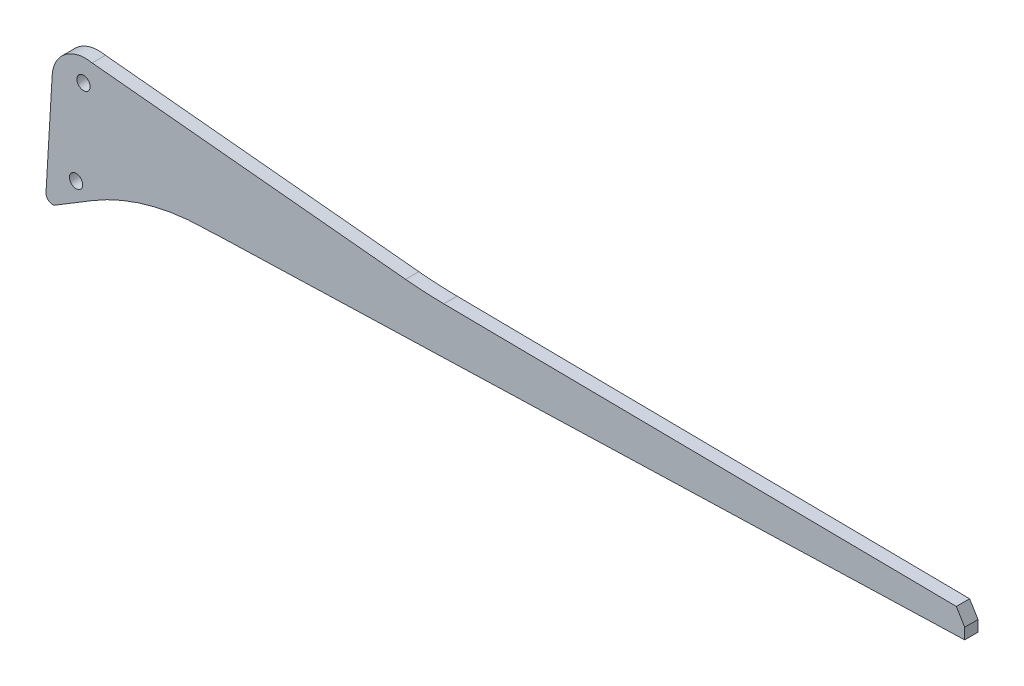
ISO-10303-21;
HEADER;
FILE_DESCRIPTION(('STEP AP214'),'2;1');
FILE_NAME('part.step','',(''),(''),'','','');
FILE_SCHEMA(('AUTOMOTIVE_DESIGN { 1 0 10303 214 1 1 1 1 }'));
ENDSEC;
DATA;
#1=APPLICATION_CONTEXT('core data for automotive mechanical design processes');
#2=APPLICATION_PROTOCOL_DEFINITION('international standard','automotive_design',2000,#1);
#3=PRODUCT_CONTEXT('',#1,'mechanical');
#4=PRODUCT('Part','Part','',(#3));
#5=PRODUCT_RELATED_PRODUCT_CATEGORY('part','',(#4));
#6=PRODUCT_DEFINITION_FORMATION('','',#4);
#7=PRODUCT_DEFINITION_CONTEXT('part definition',#1,'design');
#8=PRODUCT_DEFINITION('design','',#6,#7);
#9=PRODUCT_DEFINITION_SHAPE('','',#8);
#10=(LENGTH_UNIT() NAMED_UNIT(*) SI_UNIT(.MILLI.,.METRE.));
#11=(NAMED_UNIT(*) PLANE_ANGLE_UNIT() SI_UNIT($,.RADIAN.));
#12=(NAMED_UNIT(*) SI_UNIT($,.STERADIAN.) SOLID_ANGLE_UNIT());
#13=UNCERTAINTY_MEASURE_WITH_UNIT(LENGTH_MEASURE(1.E-05),#10,'distance_accuracy_value','');
#14=(GEOMETRIC_REPRESENTATION_CONTEXT(3) GLOBAL_UNCERTAINTY_ASSIGNED_CONTEXT((#13)) GLOBAL_UNIT_ASSIGNED_CONTEXT((#10,
#11,#12)) REPRESENTATION_CONTEXT('',''));
#15=CARTESIAN_POINT('',(0.,0.,0.));
#16=DIRECTION('',(0.,0.,1.));
#17=DIRECTION('',(1.,0.,0.));
#18=AXIS2_PLACEMENT_3D('',#15,#16,#17);
#19=CARTESIAN_POINT('',(194.893507613305,57.6898471594628,-4.5));
#20=DIRECTION('',(-0.0113371299272643,-0.999935732677362,0.));
#21=DIRECTION('',(0.999935732677362,-0.0113371299272643,0.));
#22=AXIS2_PLACEMENT_3D('',#19,#20,#21);
#23=PLANE('',#22);
#24=DIRECTION('',(0.999935732677362,-0.0113371299272643,0.));
#25=VECTOR('',#24,1.);
#26=CARTESIAN_POINT('',(194.893507613305,57.6898471594628,-1.5));
#27=LINE('',#26,#25);
#28=CARTESIAN_POINT('',(401.028703251367,55.3527154627352,-1.5));
#29=VERTEX_POINT('',#28);
#30=CARTESIAN_POINT('',(516.640980928736,54.0419198081927,-1.5));
#31=VERTEX_POINT('',#30);
#32=EDGE_CURVE('E165',#29,#31,#27,.T.);
#33=ORIENTED_EDGE('',*,*,#32,.T.);
#34=DIRECTION('',(0.,0.,1.));
#35=VECTOR('',#34,1.);
#36=CARTESIAN_POINT('',(516.640980928736,54.0419198081927,-4.5));
#37=LINE('',#36,#35);
#38=CARTESIAN_POINT('',(516.640980928736,54.0419198081927,-4.5));
#39=VERTEX_POINT('',#38);
#40=EDGE_CURVE('E11',#39,#31,#37,.T.);
#41=ORIENTED_EDGE('',*,*,#40,.F.);
#42=DIRECTION('',(0.999935732677362,-0.0113371299272643,0.));
#43=VECTOR('',#42,1.);
#44=CARTESIAN_POINT('',(194.893507613305,57.6898471594628,-4.5));
#45=LINE('',#44,#43);
#46=CARTESIAN_POINT('',(401.028703251367,55.3527154627352,-4.5));
#47=VERTEX_POINT('',#46);
#48=EDGE_CURVE('E214',#47,#39,#45,.T.);
#49=ORIENTED_EDGE('',*,*,#48,.F.);
#50=DIRECTION('',(0.,0.,1.));
#51=VECTOR('',#50,1.);
#52=CARTESIAN_POINT('',(401.028703251367,55.3527154627352,-4.5));
#53=LINE('',#52,#51);
#54=EDGE_CURVE('E41',#47,#29,#53,.T.);
#55=ORIENTED_EDGE('',*,*,#54,.T.);
#56=EDGE_LOOP('',(#33,#41,#49,#55));
#57=FACE_BOUND('',#56,.T.);
#58=ADVANCED_FACE('F37',(#57),#23,.F.);
#59=CARTESIAN_POINT('',(442.883651957119,175.722905078881,-4.5));
#60=DIRECTION('',(-0.85516269943095,-0.518359679664584,0.));
#61=DIRECTION('',(0.518359679664584,-0.85516269943095,0.));
#62=AXIS2_PLACEMENT_3D('',#59,#60,#61);
#63=PLANE('',#62);
#64=DIRECTION('',(0.518359679664584,-0.85516269943095,0.));
#65=VECTOR('',#64,1.);
#66=CARTESIAN_POINT('',(442.883651957119,175.722905078881,-1.5));
#67=LINE('',#66,#65);
#68=CARTESIAN_POINT('',(518.528128536413,50.9286023459828,-1.5));
#69=VERTEX_POINT('',#68);
#70=EDGE_CURVE('E101',#31,#69,#67,.T.);
#71=ORIENTED_EDGE('',*,*,#70,.T.);
#72=DIRECTION('',(0.,0.,1.));
#73=VECTOR('',#72,1.);
#74=CARTESIAN_POINT('',(518.528128536413,50.9286023459828,-4.5));
#75=LINE('',#74,#73);
#76=CARTESIAN_POINT('',(518.528128536413,50.9286023459828,-4.5));
#77=VERTEX_POINT('',#76);
#78=EDGE_CURVE('E47',#77,#69,#75,.T.);
#79=ORIENTED_EDGE('',*,*,#78,.F.);
#80=DIRECTION('',(0.518359679664584,-0.85516269943095,0.));
#81=VECTOR('',#80,1.);
#82=CARTESIAN_POINT('',(442.883651957119,175.722905078881,-4.5));
#83=LINE('',#82,#81);
#84=EDGE_CURVE('E55',#39,#77,#83,.T.);
#85=ORIENTED_EDGE('',*,*,#84,.F.);
#86=ORIENTED_EDGE('',*,*,#40,.T.);
#87=EDGE_LOOP('',(#71,#79,#85,#86));
#88=FACE_BOUND('',#87,.T.);
#89=ADVANCED_FACE('F232',(#88),#63,.F.);
#90=CARTESIAN_POINT('',(518.528128536412,25.1794372313019,-4.5));
#91=DIRECTION('',(1.,0.,0.));
#92=DIRECTION('',(0.,1.,0.));
#93=AXIS2_PLACEMENT_3D('',#90,#91,#92);
#94=PLANE('',#93);
#95=DIRECTION('',(0.,1.,0.));
#96=VECTOR('',#95,1.);
#97=CARTESIAN_POINT('',(518.528128536412,25.1794372313019,-1.5));
#98=LINE('',#97,#96);
#99=CARTESIAN_POINT('',(518.528128536413,48.4434428202795,-1.5));
#100=VERTEX_POINT('',#99);
#101=EDGE_CURVE('E137',#100,#69,#98,.T.);
#102=ORIENTED_EDGE('',*,*,#101,.F.);
#103=DIRECTION('',(0.,0.,1.));
#104=VECTOR('',#103,1.);
#105=CARTESIAN_POINT('',(518.528128536413,48.4434428202795,-4.5));
#106=LINE('',#105,#104);
#107=CARTESIAN_POINT('',(518.528128536413,48.4434428202795,-4.5));
#108=VERTEX_POINT('',#107);
#109=EDGE_CURVE('E133',#108,#100,#106,.T.);
#110=ORIENTED_EDGE('',*,*,#109,.F.);
#111=DIRECTION('',(0.,1.,0.));
#112=VECTOR('',#111,1.);
#113=CARTESIAN_POINT('',(518.528128536412,25.1794372313019,-4.5));
#114=LINE('',#113,#112);
#115=EDGE_CURVE('E136',#108,#77,#114,.T.);
#116=ORIENTED_EDGE('',*,*,#115,.T.);
#117=ORIENTED_EDGE('',*,*,#78,.T.);
#118=EDGE_LOOP('',(#102,#110,#116,#117));
#119=FACE_BOUND('',#118,.T.);
#120=ADVANCED_FACE('F135',(#119),#94,.T.);
#121=CARTESIAN_POINT('',(194.115562190128,38.3945320907913,-4.5));
#122=DIRECTION('',(0.0309608637240549,-0.999520597545373,0.));
#123=DIRECTION('',(0.999520597545374,0.0309608637240549,0.));
#124=AXIS2_PLACEMENT_3D('',#121,#122,#123);
#125=PLANE('',#124);
#126=DIRECTION('',(0.999520597545373,0.0309608637240549,0.));
#127=VECTOR('',#126,1.);
#128=CARTESIAN_POINT('',(194.115562190128,38.3945320907913,-1.5));
#129=LINE('',#128,#127);
#130=CARTESIAN_POINT('',(350.408239258089,43.2358092867314,-1.5));
#131=VERTEX_POINT('',#130);
#132=EDGE_CURVE('E192',#131,#100,#129,.T.);
#133=ORIENTED_EDGE('',*,*,#132,.F.);
#134=DIRECTION('',(0.,0.,1.));
#135=VECTOR('',#134,1.);
#136=CARTESIAN_POINT('',(350.408239258089,43.2358092867314,-4.5));
#137=LINE('',#136,#135);
#138=CARTESIAN_POINT('',(350.408239258089,43.2358092867314,-4.5));
#139=VERTEX_POINT('',#138);
#140=EDGE_CURVE('E142',#139,#131,#137,.T.);
#141=ORIENTED_EDGE('',*,*,#140,.F.);
#142=DIRECTION('',(0.999520597545373,0.0309608637240549,0.));
#143=VECTOR('',#142,1.);
#144=CARTESIAN_POINT('',(194.115562190128,38.3945320907913,-4.5));
#145=LINE('',#144,#143);
#146=EDGE_CURVE('E148',#139,#108,#145,.T.);
#147=ORIENTED_EDGE('',*,*,#146,.T.);
#148=ORIENTED_EDGE('',*,*,#109,.T.);
#149=EDGE_LOOP('',(#133,#141,#147,#148));
#150=FACE_BOUND('',#149,.T.);
#151=ADVANCED_FACE('F151',(#150),#125,.T.);
#152=CARTESIAN_POINT('',(346.531386473426,93.0852828294485,-4.5));
#153=DIRECTION('',(0.,0.,1.));
#154=DIRECTION('',(1.,0.,0.));
#155=AXIS2_PLACEMENT_3D('',#152,#153,#154);
#156=CYLINDRICAL_SURFACE('',#155,50.);
#157=CARTESIAN_POINT('',(346.531386473426,93.0852828294485,-1.5));
#158=DIRECTION('',(0.,0.,1.));
#159=DIRECTION('',(1.,0.,0.));
#160=AXIS2_PLACEMENT_3D('',#157,#158,#159);
#161=CIRCLE('',#160,50.);
#162=CARTESIAN_POINT('',(347.081518126151,43.0883093694012,-1.5));
#163=VERTEX_POINT('',#162);
#164=EDGE_CURVE('E189',#163,#131,#161,.T.);
#165=ORIENTED_EDGE('',*,*,#164,.F.);
#166=DIRECTION('',(0.,0.,1.));
#167=VECTOR('',#166,1.);
#168=CARTESIAN_POINT('',(347.081518126151,43.0883093694012,-4.5));
#169=LINE('',#168,#167);
#170=CARTESIAN_POINT('',(347.081518126151,43.0883093694012,-4.5));
#171=VERTEX_POINT('',#170);
#172=EDGE_CURVE('E199',#171,#163,#169,.T.);
#173=ORIENTED_EDGE('',*,*,#172,.F.);
#174=CARTESIAN_POINT('',(346.531386473426,93.0852828294485,-4.5));
#175=DIRECTION('',(0.,0.,1.));
#176=DIRECTION('',(1.,0.,0.));
#177=AXIS2_PLACEMENT_3D('',#174,#175,#176);
#178=CIRCLE('',#177,50.);
#179=EDGE_CURVE('E152',#171,#139,#178,.T.);
#180=ORIENTED_EDGE('',*,*,#179,.T.);
#181=ORIENTED_EDGE('',*,*,#140,.T.);
#182=EDGE_LOOP('',(#165,#173,#180,#181));
#183=FACE_BOUND('',#182,.T.);
#184=ADVANCED_FACE('F262',(#183),#156,.T.);
#185=CARTESIAN_POINT('',(347.631649778876,-6.90866409064605,-4.5));
#186=DIRECTION('',(0.,0.,1.));
#187=DIRECTION('',(1.,0.,0.));
#188=AXIS2_PLACEMENT_3D('',#185,#186,#187);
#189=CYLINDRICAL_SURFACE('',#188,50.);
#190=CARTESIAN_POINT('',(347.631649778876,-6.90866409064605,-1.5));
#191=DIRECTION('',(0.,0.,1.));
#192=DIRECTION('',(1.,0.,0.));
#193=AXIS2_PLACEMENT_3D('',#190,#191,#192);
#194=CIRCLE('',#193,50.);
#195=CARTESIAN_POINT('',(321.713665795647,35.8494708809015,-1.5));
#196=VERTEX_POINT('',#195);
#197=EDGE_CURVE('E186',#163,#196,#194,.T.);
#198=ORIENTED_EDGE('',*,*,#197,.T.);
#199=DIRECTION('',(0.,0.,1.));
#200=VECTOR('',#199,1.);
#201=CARTESIAN_POINT('',(321.713665795647,35.8494708809015,-4.5));
#202=LINE('',#201,#200);
#203=CARTESIAN_POINT('',(321.713665795647,35.8494708809015,-4.5));
#204=VERTEX_POINT('',#203);
#205=EDGE_CURVE('E201',#204,#196,#202,.T.);
#206=ORIENTED_EDGE('',*,*,#205,.F.);
#207=CARTESIAN_POINT('',(347.631649778876,-6.90866409064605,-4.5));
#208=DIRECTION('',(0.,0.,1.));
#209=DIRECTION('',(1.,0.,0.));
#210=AXIS2_PLACEMENT_3D('',#207,#208,#209);
#211=CIRCLE('',#210,50.);
#212=EDGE_CURVE('E154',#171,#204,#211,.T.);
#213=ORIENTED_EDGE('',*,*,#212,.F.);
#214=ORIENTED_EDGE('',*,*,#172,.T.);
#215=EDGE_LOOP('',(#198,#206,#213,#214));
#216=FACE_BOUND('',#215,.T.);
#217=ADVANCED_FACE('F265',(#216),#189,.F.);
#218=CARTESIAN_POINT('',(223.970283281814,-23.3980015391633,-4.5));
#219=DIRECTION('',(0.518359679664585,-0.85516269943095,0.));
#220=DIRECTION('',(0.85516269943095,0.518359679664585,0.));
#221=AXIS2_PLACEMENT_3D('',#218,#219,#220);
#222=PLANE('',#221);
#223=DIRECTION('',(0.85516269943095,0.518359679664585,0.));
#224=VECTOR('',#223,1.);
#225=CARTESIAN_POINT('',(223.970283281814,-23.3980015391633,-1.5));
#226=LINE('',#225,#224);
#227=CARTESIAN_POINT('',(313.158043741331,30.6634524655077,-1.5));
#228=VERTEX_POINT('',#227);
#229=EDGE_CURVE('E183',#228,#196,#226,.T.);
#230=ORIENTED_EDGE('',*,*,#229,.F.);
#231=DIRECTION('',(0.,0.,1.));
#232=VECTOR('',#231,1.);
#233=CARTESIAN_POINT('',(313.158043741331,30.6634524655077,-4.5));
#234=LINE('',#233,#232);
#235=CARTESIAN_POINT('',(313.158043741331,30.6634524655077,-4.5));
#236=VERTEX_POINT('',#235);
#237=EDGE_CURVE('E203',#236,#228,#234,.T.);
#238=ORIENTED_EDGE('',*,*,#237,.F.);
#239=DIRECTION('',(0.85516269943095,0.518359679664585,0.));
#240=VECTOR('',#239,1.);
#241=CARTESIAN_POINT('',(223.970283281814,-23.3980015391633,-4.5));
#242=LINE('',#241,#240);
#243=EDGE_CURVE('E306',#236,#204,#242,.T.);
#244=ORIENTED_EDGE('',*,*,#243,.T.);
#245=ORIENTED_EDGE('',*,*,#205,.T.);
#246=EDGE_LOOP('',(#230,#238,#244,#245));
#247=FACE_BOUND('',#246,.T.);
#248=ADVANCED_FACE('F269',(#247),#222,.T.);
#249=CARTESIAN_POINT('',(312.80088320008,32.1203108483896,-4.5));
#250=DIRECTION('',(0.,0.,1.));
#251=DIRECTION('',(1.,0.,0.));
#252=AXIS2_PLACEMENT_3D('',#249,#250,#251);
#253=CYLINDRICAL_SURFACE('',#252,1.50000000000001);
#254=CARTESIAN_POINT('',(312.80088320008,32.1203108483896,-1.5));
#255=DIRECTION('',(0.,0.,1.));
#256=DIRECTION('',(1.,0.,0.));
#257=AXIS2_PLACEMENT_3D('',#254,#255,#256);
#258=CIRCLE('',#257,1.50000000000001);
#259=CARTESIAN_POINT('',(311.30348794775,32.2086706712781,-1.5));
#260=VERTEX_POINT('',#259);
#261=EDGE_CURVE('E180',#260,#228,#258,.T.);
#262=ORIENTED_EDGE('',*,*,#261,.F.);
#263=DIRECTION('',(0.,0.,1.));
#264=VECTOR('',#263,1.);
#265=CARTESIAN_POINT('',(311.30348794775,32.2086706712781,-4.5));
#266=LINE('',#265,#264);
#267=CARTESIAN_POINT('',(311.30348794775,32.2086706712781,-4.5));
#268=VERTEX_POINT('',#267);
#269=EDGE_CURVE('E205',#268,#260,#266,.T.);
#270=ORIENTED_EDGE('',*,*,#269,.F.);
#271=CARTESIAN_POINT('',(312.80088320008,32.1203108483896,-4.5));
#272=DIRECTION('',(0.,0.,1.));
#273=DIRECTION('',(1.,0.,0.));
#274=AXIS2_PLACEMENT_3D('',#271,#272,#273);
#275=CIRCLE('',#274,1.50000000000001);
#276=EDGE_CURVE('E300',#268,#236,#275,.T.);
#277=ORIENTED_EDGE('',*,*,#276,.T.);
#278=ORIENTED_EDGE('',*,*,#237,.T.);
#279=EDGE_LOOP('',(#262,#270,#277,#278));
#280=FACE_BOUND('',#279,.T.);
#281=ADVANCED_FACE('F273',(#280),#253,.T.);
#282=CARTESIAN_POINT('',(310.48491959072,18.3367509293248,-4.5));
#283=DIRECTION('',(-0.998263501553038,0.0589065485923811,0.));
#284=DIRECTION('',(-0.0589065485923811,-0.998263501553039,0.));
#285=AXIS2_PLACEMENT_3D('',#282,#283,#284);
#286=PLANE('',#285);
#287=DIRECTION('',(-0.0589065485923811,-0.998263501553039,0.));
#288=VECTOR('',#287,1.);
#289=CARTESIAN_POINT('',(310.48491959072,18.3367509293248,-1.5));
#290=LINE('',#289,#288);
#291=CARTESIAN_POINT('',(312.698152342273,55.8434378616231,-1.5));
#292=VERTEX_POINT('',#291);
#293=EDGE_CURVE('E177',#292,#260,#290,.T.);
#294=ORIENTED_EDGE('',*,*,#293,.F.);
#295=DIRECTION('',(0.,0.,1.));
#296=VECTOR('',#295,1.);
#297=CARTESIAN_POINT('',(312.698152342273,55.8434378616231,-4.5));
#298=LINE('',#297,#296);
#299=CARTESIAN_POINT('',(312.698152342273,55.8434378616231,-4.5));
#300=VERTEX_POINT('',#299);
#301=EDGE_CURVE('E207',#300,#292,#298,.T.);
#302=ORIENTED_EDGE('',*,*,#301,.F.);
#303=DIRECTION('',(-0.0589065485923811,-0.998263501553039,0.));
#304=VECTOR('',#303,1.);
#305=CARTESIAN_POINT('',(310.48491959072,18.3367509293248,-4.5));
#306=LINE('',#305,#304);
#307=EDGE_CURVE('E298',#300,#268,#306,.T.);
#308=ORIENTED_EDGE('',*,*,#307,.T.);
#309=ORIENTED_EDGE('',*,*,#269,.T.);
#310=EDGE_LOOP('',(#294,#302,#308,#309));
#311=FACE_BOUND('',#310,.T.);
#312=ADVANCED_FACE('F277',(#311),#286,.T.);
#313=CARTESIAN_POINT('',(320.185128603921,55.4016387471803,-4.5));
#314=DIRECTION('',(0.,0.,1.));
#315=DIRECTION('',(1.,0.,0.));
#316=AXIS2_PLACEMENT_3D('',#313,#314,#315);
#317=CYLINDRICAL_SURFACE('',#316,7.5);
#318=CARTESIAN_POINT('',(320.185128603921,55.4016387471803,-1.5));
#319=DIRECTION('',(0.,0.,1.));
#320=DIRECTION('',(1.,0.,0.));
#321=AXIS2_PLACEMENT_3D('',#318,#319,#320);
#322=CIRCLE('',#321,7.5);
#323=CARTESIAN_POINT('',(321.713665795647,62.7442250799045,-1.5));
#324=VERTEX_POINT('',#323);
#325=EDGE_CURVE('E174',#324,#292,#322,.T.);
#326=ORIENTED_EDGE('',*,*,#325,.F.);
#327=DIRECTION('',(0.,0.,1.));
#328=VECTOR('',#327,1.);
#329=CARTESIAN_POINT('',(321.713665795647,62.7442250799045,-4.5));
#330=LINE('',#329,#328);
#331=CARTESIAN_POINT('',(321.713665795647,62.7442250799045,-4.5));
#332=VERTEX_POINT('',#331);
#333=EDGE_CURVE('E209',#332,#324,#330,.T.);
#334=ORIENTED_EDGE('',*,*,#333,.F.);
#335=CARTESIAN_POINT('',(320.185128603921,55.4016387471803,-4.5));
#336=DIRECTION('',(0.,0.,1.));
#337=DIRECTION('',(1.,0.,0.));
#338=AXIS2_PLACEMENT_3D('',#335,#336,#337);
#339=CIRCLE('',#338,7.5);
#340=EDGE_CURVE('E292',#332,#300,#339,.T.);
#341=ORIENTED_EDGE('',*,*,#340,.T.);
#342=ORIENTED_EDGE('',*,*,#301,.T.);
#343=EDGE_LOOP('',(#326,#334,#341,#342));
#344=FACE_BOUND('',#343,.T.);
#345=ADVANCED_FACE('F243',(#344),#317,.T.);
#346=CARTESIAN_POINT('',(199.375115552335,74.7213099729958,-4.5));
#347=DIRECTION('',(-0.0974353236124753,-0.995241858902916,0.));
#348=DIRECTION('',(0.995241858902916,-0.0974353236124753,0.));
#349=AXIS2_PLACEMENT_3D('',#346,#347,#348);
#350=PLANE('',#349);
#351=DIRECTION('',(0.995241858902916,-0.0974353236124753,0.));
#352=VECTOR('',#351,1.);
#353=CARTESIAN_POINT('',(199.375115552335,74.7213099729958,-1.5));
#354=LINE('',#353,#352);
#355=CARTESIAN_POINT('',(392.418883882845,55.8221028401798,-1.5));
#356=VERTEX_POINT('',#355);
#357=EDGE_CURVE('E171',#324,#356,#354,.T.);
#358=ORIENTED_EDGE('',*,*,#357,.T.);
#359=DIRECTION('',(0.,0.,1.));
#360=VECTOR('',#359,1.);
#361=CARTESIAN_POINT('',(392.418883882845,55.8221028401798,-4.5));
#362=LINE('',#361,#360);
#363=CARTESIAN_POINT('',(392.418883882845,55.8221028401798,-4.5));
#364=VERTEX_POINT('',#363);
#365=EDGE_CURVE('E210',#364,#356,#362,.T.);
#366=ORIENTED_EDGE('',*,*,#365,.F.);
#367=DIRECTION('',(0.995241858902916,-0.0974353236124753,0.));
#368=VECTOR('',#367,1.);
#369=CARTESIAN_POINT('',(199.375115552335,74.7213099729958,-4.5));
#370=LINE('',#369,#368);
#371=EDGE_CURVE('E290',#332,#364,#370,.T.);
#372=ORIENTED_EDGE('',*,*,#371,.F.);
#373=ORIENTED_EDGE('',*,*,#333,.T.);
#374=EDGE_LOOP('',(#358,#366,#372,#373));
#375=FACE_BOUND('',#374,.T.);
#376=ADVANCED_FACE('F238',(#375),#350,.F.);
#377=CARTESIAN_POINT('',(318.086670008954,37.86614275544,-4.5));
#378=DIRECTION('',(0.,0.,1.));
#379=DIRECTION('',(1.,0.,0.));
#380=AXIS2_PLACEMENT_3D('',#377,#378,#379);
#381=CYLINDRICAL_SURFACE('',#380,1.50000000000001);
#382=CARTESIAN_POINT('',(318.086670008954,37.86614275544,-4.5));
#383=DIRECTION('',(0.,0.,1.));
#384=DIRECTION('',(1.,0.,0.));
#385=AXIS2_PLACEMENT_3D('',#382,#383,#384);
#386=CIRCLE('',#385,1.50000000000001);
#387=CARTESIAN_POINT('',(319.586670008954,37.86614275544,-4.5));
#388=VERTEX_POINT('',#387);
#389=EDGE_CURVE('E248',#388,#388,#386,.T.);
#390=ORIENTED_EDGE('',*,*,#389,.F.);
#391=EDGE_LOOP('',(#390));
#392=FACE_BOUND('',#391,.T.);
#393=CARTESIAN_POINT('',(318.086670008954,37.86614275544,-1.5));
#394=DIRECTION('',(0.,0.,1.));
#395=DIRECTION('',(1.,0.,0.));
#396=AXIS2_PLACEMENT_3D('',#393,#394,#395);
#397=CIRCLE('',#396,1.50000000000001);
#398=CARTESIAN_POINT('',(319.586670008954,37.86614275544,-1.5));
#399=VERTEX_POINT('',#398);
#400=EDGE_CURVE('E162',#399,#399,#397,.T.);
#401=ORIENTED_EDGE('',*,*,#400,.T.);
#402=EDGE_LOOP('',(#401));
#403=FACE_BOUND('',#402,.T.);
#404=ADVANCED_FACE('F227',(#392,#403),#381,.F.);
#405=CARTESIAN_POINT('',(319.765342952341,57.86614275544,-4.5));
#406=DIRECTION('',(0.,0.,1.));
#407=DIRECTION('',(1.,0.,0.));
#408=AXIS2_PLACEMENT_3D('',#405,#406,#407);
#409=CYLINDRICAL_SURFACE('',#408,1.5);
#410=CARTESIAN_POINT('',(319.765342952341,57.86614275544,-4.5));
#411=DIRECTION('',(0.,0.,1.));
#412=DIRECTION('',(1.,0.,0.));
#413=AXIS2_PLACEMENT_3D('',#410,#411,#412);
#414=CIRCLE('',#413,1.5);
#415=CARTESIAN_POINT('',(321.265342952341,57.86614275544,-4.5));
#416=VERTEX_POINT('',#415);
#417=EDGE_CURVE('E195',#416,#416,#414,.T.);
#418=ORIENTED_EDGE('',*,*,#417,.F.);
#419=EDGE_LOOP('',(#418));
#420=FACE_BOUND('',#419,.T.);
#421=CARTESIAN_POINT('',(319.765342952341,57.86614275544,-1.5));
#422=DIRECTION('',(0.,0.,1.));
#423=DIRECTION('',(1.,0.,0.));
#424=AXIS2_PLACEMENT_3D('',#421,#422,#423);
#425=CIRCLE('',#424,1.5);
#426=CARTESIAN_POINT('',(321.265342952341,57.86614275544,-1.5));
#427=VERTEX_POINT('',#426);
#428=EDGE_CURVE('E159',#427,#427,#425,.T.);
#429=ORIENTED_EDGE('',*,*,#428,.T.);
#430=EDGE_LOOP('',(#429));
#431=FACE_BOUND('',#430,.T.);
#432=ADVANCED_FACE('F39',(#420,#431),#409,.F.);
#433=CARTESIAN_POINT('',(402.162416244093,155.346288730471,-4.5));
#434=DIRECTION('',(0.,0.,1.));
#435=DIRECTION('',(1.,0.,0.));
#436=AXIS2_PLACEMENT_3D('',#433,#434,#435);
#437=CYLINDRICAL_SURFACE('',#436,100.);
#438=CARTESIAN_POINT('',(402.162416244093,155.346288730471,-1.5));
#439=DIRECTION('',(0.,0.,1.));
#440=DIRECTION('',(1.,0.,0.));
#441=AXIS2_PLACEMENT_3D('',#438,#439,#440);
#442=CIRCLE('',#441,100.);
#443=EDGE_CURVE('E168',#29,#356,#442,.F.);
#444=ORIENTED_EDGE('',*,*,#443,.F.);
#445=ORIENTED_EDGE('',*,*,#54,.F.);
#446=CARTESIAN_POINT('',(402.162416244093,155.346288730471,-4.5));
#447=DIRECTION('',(0.,0.,1.));
#448=DIRECTION('',(1.,0.,0.));
#449=AXIS2_PLACEMENT_3D('',#446,#447,#448);
#450=CIRCLE('',#449,100.);
#451=EDGE_CURVE('E293',#47,#364,#450,.F.);
#452=ORIENTED_EDGE('',*,*,#451,.T.);
#453=ORIENTED_EDGE('',*,*,#365,.T.);
#454=EDGE_LOOP('',(#444,#445,#452,#453));
#455=FACE_BOUND('',#454,.T.);
#456=ADVANCED_FACE('F218',(#455),#437,.F.);
#457=CARTESIAN_POINT('',(194.524909183126,25.1794372313092,-4.5));
#458=DIRECTION('',(0.,0.,1.));
#459=DIRECTION('',(1.,0.,0.));
#460=AXIS2_PLACEMENT_3D('',#457,#458,#459);
#461=PLANE('',#460);
#462=ORIENTED_EDGE('',*,*,#417,.T.);
#463=EDGE_LOOP('',(#462));
#464=FACE_BOUND('',#463,.T.);
#465=ORIENTED_EDGE('',*,*,#389,.T.);
#466=EDGE_LOOP('',(#465));
#467=FACE_BOUND('',#466,.T.);
#468=ORIENTED_EDGE('',*,*,#48,.T.);
#469=ORIENTED_EDGE('',*,*,#84,.T.);
#470=ORIENTED_EDGE('',*,*,#115,.F.);
#471=ORIENTED_EDGE('',*,*,#146,.F.);
#472=ORIENTED_EDGE('',*,*,#179,.F.);
#473=ORIENTED_EDGE('',*,*,#212,.T.);
#474=ORIENTED_EDGE('',*,*,#243,.F.);
#475=ORIENTED_EDGE('',*,*,#276,.F.);
#476=ORIENTED_EDGE('',*,*,#307,.F.);
#477=ORIENTED_EDGE('',*,*,#340,.F.);
#478=ORIENTED_EDGE('',*,*,#371,.T.);
#479=ORIENTED_EDGE('',*,*,#451,.F.);
#480=EDGE_LOOP('',(#468,#469,#470,#471,#472,#473,#474,#475,#476,#477,#478,#479));
#481=FACE_BOUND('',#480,.T.);
#482=ADVANCED_FACE('F146',(#464,#467,#481),#461,.F.);
#483=CARTESIAN_POINT('',(194.524909183126,25.1794372313092,-1.5));
#484=DIRECTION('',(0.,0.,1.));
#485=DIRECTION('',(1.,0.,0.));
#486=AXIS2_PLACEMENT_3D('',#483,#484,#485);
#487=PLANE('',#486);
#488=ORIENTED_EDGE('',*,*,#428,.F.);
#489=EDGE_LOOP('',(#488));
#490=FACE_BOUND('',#489,.T.);
#491=ORIENTED_EDGE('',*,*,#400,.F.);
#492=EDGE_LOOP('',(#491));
#493=FACE_BOUND('',#492,.T.);
#494=ORIENTED_EDGE('',*,*,#32,.F.);
#495=ORIENTED_EDGE('',*,*,#443,.T.);
#496=ORIENTED_EDGE('',*,*,#357,.F.);
#497=ORIENTED_EDGE('',*,*,#325,.T.);
#498=ORIENTED_EDGE('',*,*,#293,.T.);
#499=ORIENTED_EDGE('',*,*,#261,.T.);
#500=ORIENTED_EDGE('',*,*,#229,.T.);
#501=ORIENTED_EDGE('',*,*,#197,.F.);
#502=ORIENTED_EDGE('',*,*,#164,.T.);
#503=ORIENTED_EDGE('',*,*,#132,.T.);
#504=ORIENTED_EDGE('',*,*,#101,.T.);
#505=ORIENTED_EDGE('',*,*,#70,.F.);
#506=EDGE_LOOP('',(#494,#495,#496,#497,#498,#499,#500,#501,#502,#503,#504,#505));
#507=FACE_BOUND('',#506,.T.);
#508=ADVANCED_FACE('F216',(#490,#493,#507),#487,.T.);
#509=CLOSED_SHELL('',(#58,#89,#120,#151,#184,#217,#248,#281,#312,#345,#376,#404,#432,#456,#482,#508));
#510=MANIFOLD_SOLID_BREP('B2',#509);
#511=ADVANCED_BREP_SHAPE_REPRESENTATION('',(#18,#510),#14);
#512=SHAPE_DEFINITION_REPRESENTATION(#9,#511);
ENDSEC;
END-ISO-10303-21;
